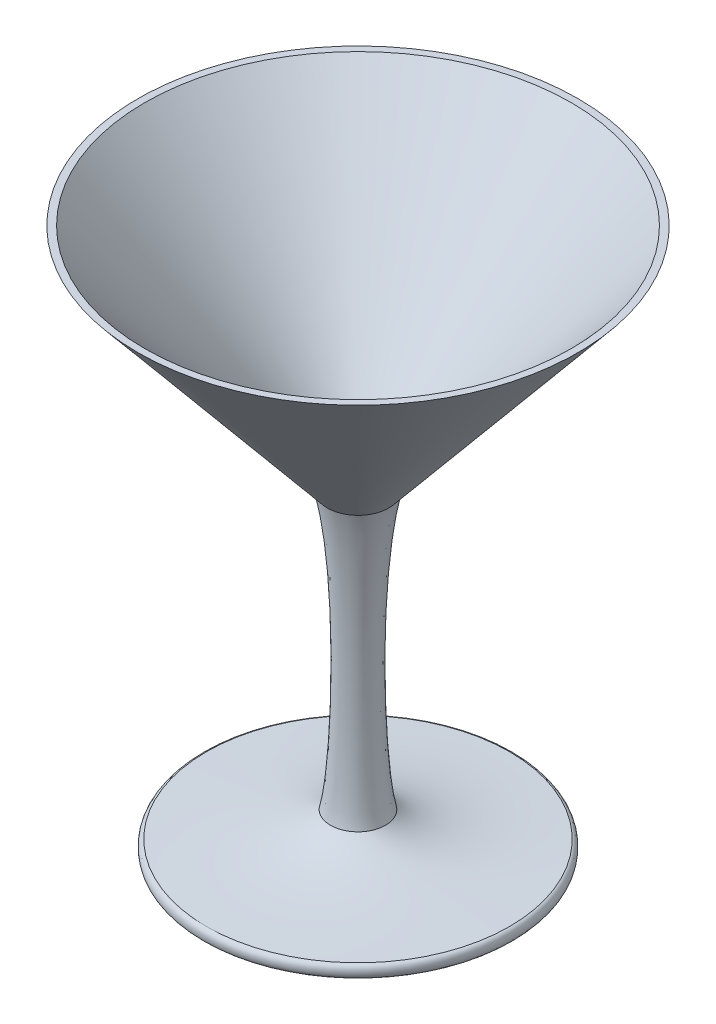
ISO-10303-21;
HEADER;
FILE_DESCRIPTION(('STEP AP214'),'2;1');
FILE_NAME('part.step','',(''),(''),'','','');
FILE_SCHEMA(('AUTOMOTIVE_DESIGN { 1 0 10303 214 1 1 1 1 }'));
ENDSEC;
DATA;
#1=APPLICATION_CONTEXT('core data for automotive mechanical design processes');
#2=APPLICATION_PROTOCOL_DEFINITION('international standard','automotive_design',2000,#1);
#3=PRODUCT_CONTEXT('',#1,'mechanical');
#4=PRODUCT('Part','Part','',(#3));
#5=PRODUCT_RELATED_PRODUCT_CATEGORY('part','',(#4));
#6=PRODUCT_DEFINITION_FORMATION('','',#4);
#7=PRODUCT_DEFINITION_CONTEXT('part definition',#1,'design');
#8=PRODUCT_DEFINITION('design','',#6,#7);
#9=PRODUCT_DEFINITION_SHAPE('','',#8);
#10=(LENGTH_UNIT() NAMED_UNIT(*) SI_UNIT(.MILLI.,.METRE.));
#11=(NAMED_UNIT(*) PLANE_ANGLE_UNIT() SI_UNIT($,.RADIAN.));
#12=(NAMED_UNIT(*) SI_UNIT($,.STERADIAN.) SOLID_ANGLE_UNIT());
#13=UNCERTAINTY_MEASURE_WITH_UNIT(LENGTH_MEASURE(1.E-05),#10,'distance_accuracy_value','');
#14=(GEOMETRIC_REPRESENTATION_CONTEXT(3) GLOBAL_UNCERTAINTY_ASSIGNED_CONTEXT((#13)) GLOBAL_UNIT_ASSIGNED_CONTEXT((#10,
#11,#12)) REPRESENTATION_CONTEXT('',''));
#15=CARTESIAN_POINT('',(0.,0.,0.));
#16=DIRECTION('',(0.,0.,1.));
#17=DIRECTION('',(1.,0.,0.));
#18=AXIS2_PLACEMENT_3D('',#15,#16,#17);
#19=CARTESIAN_POINT('',(-159.420742678776,-336.87748813054,0.));
#20=DIRECTION('',(0.,-1.,0.));
#21=DIRECTION('',(0.,0.,-1.));
#22=AXIS2_PLACEMENT_3D('',#19,#20,#21);
#23=PLANE('',#22);
#24=CARTESIAN_POINT('',(-159.420742678776,-336.87748813054,0.));
#25=DIRECTION('',(0.,1.,0.));
#26=DIRECTION('',(0.,0.,1.));
#27=AXIS2_PLACEMENT_3D('',#24,#25,#26);
#28=CIRCLE('',#27,31.6674314944976);
#29=CARTESIAN_POINT('',(-159.420742678776,-336.87748813054,31.6674314944976));
#30=VERTEX_POINT('',#29);
#31=EDGE_CURVE('E10',#30,#30,#28,.T.);
#32=ORIENTED_EDGE('',*,*,#31,.F.);
#33=EDGE_LOOP('',(#32));
#34=FACE_BOUND('',#33,.T.);
#35=ADVANCED_FACE('F37',(#34),#23,.T.);
#36=CARTESIAN_POINT('',(-190.96464518816,-334.304345553392,0.));
#37=CARTESIAN_POINT('',(-192.19304753262,-334.61112318083,0.));
#38=CARTESIAN_POINT('',(-191.925483576352,-336.88284847709,0.));
#39=CARTESIAN_POINT('',(-191.088174173274,-336.87748813054,0.));
#40=B_SPLINE_CURVE_WITH_KNOTS('',3,(#36,#37,#38,#39),.UNSPECIFIED.,.F.,.F.,(4,4),(0.,
0.195979379794336),.UNSPECIFIED.);
#41=CARTESIAN_POINT('',(-159.420742678776,-270.244800903918,0.));
#42=DIRECTION('',(0.,1.,0.));
#43=AXIS1_PLACEMENT('',#41,#42);
#44=SURFACE_OF_REVOLUTION('',#40,#43);
#45=ORIENTED_EDGE('',*,*,#31,.T.);
#46=EDGE_LOOP('',(#45));
#47=FACE_BOUND('',#46,.T.);
#48=CARTESIAN_POINT('',(-159.420742678776,-334.304345553392,0.));
#49=DIRECTION('',(0.,1.,0.));
#50=DIRECTION('',(0.,0.,1.));
#51=AXIS2_PLACEMENT_3D('',#48,#49,#50);
#52=CIRCLE('',#51,31.5439025093838);
#53=CARTESIAN_POINT('',(-159.420742678776,-334.304345553392,31.5439025093838));
#54=VERTEX_POINT('',#53);
#55=EDGE_CURVE('E44',#54,#54,#52,.T.);
#56=ORIENTED_EDGE('',*,*,#55,.F.);
#57=EDGE_LOOP('',(#56));
#58=FACE_BOUND('',#57,.T.);
#59=ADVANCED_FACE('F79',(#47,#58),#44,.F.);
#60=CARTESIAN_POINT('',(-165.144069858798,-328.95329504754,0.));
#61=CARTESIAN_POINT('',(-169.837453965653,-333.171753818438,0.));
#62=CARTESIAN_POINT('',(-179.536145115249,-333.82852052167,0.));
#63=CARTESIAN_POINT('',(-190.96464518816,-334.304345553392,0.));
#64=B_SPLINE_CURVE_WITH_KNOTS('',3,(#60,#61,#62,#63),.UNSPECIFIED.,.F.,.F.,(4,4),(0.,
0.834301137813903),.UNSPECIFIED.);
#65=CARTESIAN_POINT('',(-159.420742678776,-270.244800903918,0.));
#66=DIRECTION('',(0.,1.,0.));
#67=AXIS1_PLACEMENT('',#65,#66);
#68=SURFACE_OF_REVOLUTION('',#64,#67);
#69=ORIENTED_EDGE('',*,*,#55,.T.);
#70=EDGE_LOOP('',(#69));
#71=FACE_BOUND('',#70,.T.);
#72=CARTESIAN_POINT('',(-159.420742678776,-328.95329504754,0.));
#73=DIRECTION('',(0.,1.,0.));
#74=DIRECTION('',(0.,0.,1.));
#75=AXIS2_PLACEMENT_3D('',#72,#73,#74);
#76=CIRCLE('',#75,5.72332718002147);
#77=CARTESIAN_POINT('',(-159.420742678776,-328.95329504754,5.72332718002147));
#78=VERTEX_POINT('',#77);
#79=EDGE_CURVE('E49',#78,#78,#76,.T.);
#80=ORIENTED_EDGE('',*,*,#79,.F.);
#81=EDGE_LOOP('',(#80));
#82=FACE_BOUND('',#81,.T.);
#83=ADVANCED_FACE('F82',(#71,#82),#68,.F.);
#84=CARTESIAN_POINT('',(-165.81034098499,-271.404559168786,0.));
#85=CARTESIAN_POINT('',(-162.204633443118,-287.930293232054,0.));
#86=CARTESIAN_POINT('',(-163.227748310136,-321.791320533154,0.));
#87=CARTESIAN_POINT('',(-165.144069858798,-328.953295047541,0.));
#88=B_SPLINE_CURVE_WITH_KNOTS('',3,(#84,#85,#86,#87),.UNSPECIFIED.,.F.,.F.,(4,4),(0.,1.),.UNSPECIFIED.);
#89=CARTESIAN_POINT('',(-159.420742678776,-270.244800903918,0.));
#90=DIRECTION('',(0.,1.,0.));
#91=AXIS1_PLACEMENT('',#89,#90);
#92=SURFACE_OF_REVOLUTION('',#88,#91);
#93=ORIENTED_EDGE('',*,*,#79,.T.);
#94=EDGE_LOOP('',(#93));
#95=FACE_BOUND('',#94,.T.);
#96=CARTESIAN_POINT('',(-159.420742678776,-271.404559168786,0.));
#97=DIRECTION('',(0.,1.,0.));
#98=DIRECTION('',(0.,0.,1.));
#99=AXIS2_PLACEMENT_3D('',#96,#97,#98);
#100=CIRCLE('',#99,6.38959830621391);
#101=CARTESIAN_POINT('',(-159.420742678776,-271.404559168786,6.38959830621388));
#102=VERTEX_POINT('',#101);
#103=EDGE_CURVE('E54',#102,#102,#100,.T.);
#104=ORIENTED_EDGE('',*,*,#103,.F.);
#105=EDGE_LOOP('',(#104));
#106=FACE_BOUND('',#105,.T.);
#107=ADVANCED_FACE('F85',(#95,#106),#92,.F.);
#108=CARTESIAN_POINT('',(-159.420742678776,-223.671915038773,0.));
#109=DIRECTION('',(0.,1.,0.));
#110=DIRECTION('',(0.,0.,1.));
#111=AXIS2_PLACEMENT_3D('',#108,#109,#110);
#112=CONICAL_SURFACE('',#111,45.8173729073988,0.690402372815751);
#113=CARTESIAN_POINT('',(-159.420742678776,-223.671915038773,0.));
#114=DIRECTION('',(0.,1.,0.));
#115=DIRECTION('',(0.,0.,1.));
#116=AXIS2_PLACEMENT_3D('',#113,#114,#115);
#117=CIRCLE('',#116,45.8173729073988);
#118=CARTESIAN_POINT('',(-159.420742678776,-223.671915038773,45.8173729073987));
#119=VERTEX_POINT('',#118);
#120=EDGE_CURVE('E59',#119,#119,#117,.T.);
#121=CARTESIAN_POINT('',(-159.420742678776,-271.404559168786,6.38959830621388));
#122=CARTESIAN_POINT('',(-159.420742678776,-270.907344125765,6.80030429164291));
#123=CARTESIAN_POINT('',(-159.420742678776,-270.410129082745,7.21101027707192));
#124=CARTESIAN_POINT('',(-159.420742678776,-269.415698996703,8.03242224792993));
#125=CARTESIAN_POINT('',(-159.420742678776,-268.918483953682,8.44312823335893));
#126=CARTESIAN_POINT('',(-159.420742678776,-267.92405386764,9.26454020421694));
#127=CARTESIAN_POINT('',(-159.420742678776,-267.426838824619,9.67524618964595));
#128=CARTESIAN_POINT('',(-159.420742678776,-266.432408738577,10.496658160504));
#129=CARTESIAN_POINT('',(-159.420742678776,-265.935193695556,10.907364145933));
#130=CARTESIAN_POINT('',(-159.420742678776,-264.940763609514,11.728776116791));
#131=CARTESIAN_POINT('',(-159.420742678776,-264.443548566493,12.13948210222));
#132=CARTESIAN_POINT('',(-159.420742678776,-263.449118480451,12.960894073078));
#133=CARTESIAN_POINT('',(-159.420742678776,-262.95190343743,13.371600058507));
#134=CARTESIAN_POINT('',(-159.420742678776,-261.957473351388,14.1930120293651));
#135=CARTESIAN_POINT('',(-159.420742678776,-261.460258308367,14.6037180147941));
#136=CARTESIAN_POINT('',(-159.420742678776,-260.465828222325,15.4251299856521));
#137=CARTESIAN_POINT('',(-159.420742678776,-259.968613179304,15.8358359710811));
#138=CARTESIAN_POINT('',(-159.420742678776,-258.974183093262,16.6572479419391));
#139=CARTESIAN_POINT('',(-159.420742678776,-258.476968050241,17.0679539273681));
#140=CARTESIAN_POINT('',(-159.420742678776,-257.482537964199,17.8893658982261));
#141=CARTESIAN_POINT('',(-159.420742678776,-256.985322921178,18.3000718836551));
#142=CARTESIAN_POINT('',(-159.420742678776,-255.990892835136,19.1214838545132));
#143=CARTESIAN_POINT('',(-159.420742678776,-255.493677792115,19.5321898399422));
#144=CARTESIAN_POINT('',(-159.420742678776,-254.499247706073,20.3536018108002));
#145=CARTESIAN_POINT('',(-159.420742678776,-254.002032663052,20.7643077962292));
#146=CARTESIAN_POINT('',(-159.420742678776,-253.007602577011,21.5857197670872));
#147=CARTESIAN_POINT('',(-159.420742678776,-252.51038753399,21.9964257525162));
#148=CARTESIAN_POINT('',(-159.420742678776,-251.515957447948,22.8178377233743));
#149=CARTESIAN_POINT('',(-159.420742678776,-251.018742404927,23.2285437088033));
#150=CARTESIAN_POINT('',(-159.420742678776,-250.024312318885,24.0499556796613));
#151=CARTESIAN_POINT('',(-159.420742678776,-249.527097275864,24.4606616650903));
#152=CARTESIAN_POINT('',(-159.420742678776,-248.532667189822,25.2820736359483));
#153=CARTESIAN_POINT('',(-159.420742678776,-248.035452146801,25.6927796213773));
#154=CARTESIAN_POINT('',(-159.420742678776,-247.041022060759,26.5141915922353));
#155=CARTESIAN_POINT('',(-159.420742678776,-246.543807017738,26.9248975776643));
#156=CARTESIAN_POINT('',(-159.420742678776,-245.549376931696,27.7463095485224));
#157=CARTESIAN_POINT('',(-159.420742678776,-245.052161888675,28.1570155339514));
#158=CARTESIAN_POINT('',(-159.420742678776,-244.057731802633,28.9784275048094));
#159=CARTESIAN_POINT('',(-159.420742678776,-243.560516759612,29.3891334902384));
#160=CARTESIAN_POINT('',(-159.420742678776,-242.56608667357,30.2105454610964));
#161=CARTESIAN_POINT('',(-159.420742678776,-242.068871630549,30.6212514465254));
#162=CARTESIAN_POINT('',(-159.420742678776,-241.074441544507,31.4426634173834));
#163=CARTESIAN_POINT('',(-159.420742678776,-240.577226501486,31.8533694028124));
#164=CARTESIAN_POINT('',(-159.420742678776,-239.582796415444,32.6747813736705));
#165=CARTESIAN_POINT('',(-159.420742678776,-239.085581372423,33.0854873590995));
#166=CARTESIAN_POINT('',(-159.420742678776,-238.091151286382,33.9068993299575));
#167=CARTESIAN_POINT('',(-159.420742678776,-237.593936243361,34.3176053153865));
#168=CARTESIAN_POINT('',(-159.420742678776,-236.599506157319,35.1390172862445));
#169=CARTESIAN_POINT('',(-159.420742678776,-236.102291114298,35.5497232716735));
#170=CARTESIAN_POINT('',(-159.420742678776,-235.107861028256,36.3711352425316));
#171=CARTESIAN_POINT('',(-159.420742678776,-234.610645985235,36.7818412279605));
#172=CARTESIAN_POINT('',(-159.420742678776,-233.616215899193,37.6032531988186));
#173=CARTESIAN_POINT('',(-159.420742678776,-233.119000856172,38.0139591842476));
#174=CARTESIAN_POINT('',(-159.420742678776,-232.12457077013,38.8353711551056));
#175=CARTESIAN_POINT('',(-159.420742678776,-231.627355727109,39.2460771405346));
#176=CARTESIAN_POINT('',(-159.420742678776,-230.632925641067,40.0674891113926));
#177=CARTESIAN_POINT('',(-159.420742678776,-230.135710598046,40.4781950968216));
#178=CARTESIAN_POINT('',(-159.420742678776,-229.141280512004,41.2996070676797));
#179=CARTESIAN_POINT('',(-159.420742678776,-228.644065468983,41.7103130531087));
#180=CARTESIAN_POINT('',(-159.420742678776,-227.649635382941,42.5317250239667));
#181=CARTESIAN_POINT('',(-159.420742678776,-227.15242033992,42.9424310093957));
#182=CARTESIAN_POINT('',(-159.420742678776,-226.157990253878,43.7638429802537));
#183=CARTESIAN_POINT('',(-159.420742678776,-225.660775210857,44.1745489656827));
#184=CARTESIAN_POINT('',(-159.420742678776,-224.666345124815,44.9959609365407));
#185=CARTESIAN_POINT('',(-159.420742678776,-224.169130081794,45.4066669219697));
#186=CARTESIAN_POINT('',(-159.420742678776,-223.671915038773,45.8173729073987));
#187=B_SPLINE_CURVE_WITH_KNOTS('',3,(#121,#122,#123,#124,#125,#126,#127,#128,#129,#130,#131,
#132,#133,#134,#135,#136,#137,#138,#139,#140,#141,#142,#143,#144,#145,#146,#147,#148,#149,#150,
#151,#152,#153,#154,#155,#156,#157,#158,#159,#160,#161,#162,#163,#164,#165,#166,#167,#168,#169,
#170,#171,#172,#173,#174,#175,#176,#177,#178,#179,#180,#181,#182,#183,#184,#185,#186),
.UNSPECIFIED.,.F.,.F.,(4,2,2,2,2,2,2,2,2,2,2,2,2,2,2,2,2,2,2,2,2,2,2,2,2,2,2,2,2,2,2,2,4),(0.,
1.9347144102585,3.86942882051703,5.80414323077556,7.7388576410341,9.67357205129264,
11.6082864615511,13.5430008718097,15.4777152820682,17.4124296923267,19.3471441025853,
21.2818585128438,23.2165729231023,25.1512873333608,27.0860017436194,29.0207161538779,
30.9554305641364,32.890144974395,34.8248593846535,36.759573794912,38.6942882051706,
40.6290026154291,42.5637170256876,44.4984314359462,46.4331458462047,48.3678602564632,
50.3025746667217,52.2372890769802,54.1720034872388,56.1067178974973,58.0414323077558,
59.9761467180144,61.9108611282729),.UNSPECIFIED.);
#188=EDGE_CURVE('BSEAM88',#102,#119,#187,.T.);
#189=ORIENTED_EDGE('',*,*,#103,.T.);
#190=ORIENTED_EDGE('',*,*,#120,.F.);
#191=ORIENTED_EDGE('',*,*,#188,.T.);
#192=ORIENTED_EDGE('',*,*,#188,.F.);
#193=EDGE_LOOP('',(#189,#191,#190,#192));
#194=FACE_BOUND('',#193,.T.);
#195=ADVANCED_FACE('F88',(#194),#112,.T.);
#196=CARTESIAN_POINT('',(-205.238115586175,-223.671915038773,0.));
#197=DIRECTION('',(0.,1.,0.));
#198=DIRECTION('',(0.,0.,1.));
#199=AXIS2_PLACEMENT_3D('',#196,#197,#198);
#200=PLANE('',#199);
#201=ORIENTED_EDGE('',*,*,#120,.T.);
#202=EDGE_LOOP('',(#201));
#203=FACE_BOUND('',#202,.T.);
#204=CARTESIAN_POINT('',(-159.420742678776,-223.671915038773,0.));
#205=DIRECTION('',(0.,1.,0.));
#206=DIRECTION('',(0.,0.,1.));
#207=AXIS2_PLACEMENT_3D('',#204,#205,#206);
#208=CIRCLE('',#207,44.3861114600712);
#209=CARTESIAN_POINT('',(-159.420742678776,-223.671915038773,44.3861114600712));
#210=VERTEX_POINT('',#209);
#211=EDGE_CURVE('E62',#210,#210,#208,.T.);
#212=ORIENTED_EDGE('',*,*,#211,.F.);
#213=EDGE_LOOP('',(#212));
#214=FACE_BOUND('',#213,.T.);
#215=ADVANCED_FACE('F98',(#203,#214),#200,.T.);
#216=CARTESIAN_POINT('',(-159.420742678776,-268.41123500094,0.));
#217=DIRECTION('',(0.,1.,0.));
#218=DIRECTION('',(0.,0.,1.));
#219=AXIS2_PLACEMENT_3D('',#216,#217,#218);
#220=CONICAL_SURFACE('',#219,4.77136642087952,0.724721958908642);
#221=CARTESIAN_POINT('',(-159.420742678776,-268.41123500094,0.));
#222=DIRECTION('',(0.,1.,0.));
#223=DIRECTION('',(0.,0.,1.));
#224=AXIS2_PLACEMENT_3D('',#221,#222,#223);
#225=CIRCLE('',#224,4.77136642087952);
#226=CARTESIAN_POINT('',(-159.420742678776,-268.41123500094,4.7713664208795));
#227=VERTEX_POINT('',#226);
#228=EDGE_CURVE('E65',#227,#227,#225,.T.);
#229=CARTESIAN_POINT('',(-159.420742678776,-223.671915038773,44.3861114600712));
#230=CARTESIAN_POINT('',(-159.420742678776,-224.137949621713,43.973457865913));
#231=CARTESIAN_POINT('',(-159.420742678776,-224.603984204652,43.5608042717547));
#232=CARTESIAN_POINT('',(-159.420742678776,-225.53605337053,42.7354970834382));
#233=CARTESIAN_POINT('',(-159.420742678776,-226.00208795347,42.32284348928));
#234=CARTESIAN_POINT('',(-159.420742678776,-226.934157119348,41.4975363009635));
#235=CARTESIAN_POINT('',(-159.420742678776,-227.400191702287,41.0848827068052));
#236=CARTESIAN_POINT('',(-159.420742678776,-228.332260868166,40.2595755184888));
#237=CARTESIAN_POINT('',(-159.420742678776,-228.798295451105,39.8469219243305));
#238=CARTESIAN_POINT('',(-159.420742678776,-229.730364616984,39.021614736014));
#239=CARTESIAN_POINT('',(-159.420742678776,-230.196399199923,38.6089611418558));
#240=CARTESIAN_POINT('',(-159.420742678776,-231.128468365801,37.7836539535393));
#241=CARTESIAN_POINT('',(-159.420742678776,-231.59450294874,37.371000359381));
#242=CARTESIAN_POINT('',(-159.420742678776,-232.526572114619,36.5456931710645));
#243=CARTESIAN_POINT('',(-159.420742678776,-232.992606697558,36.1330395769063));
#244=CARTESIAN_POINT('',(-159.420742678776,-233.924675863437,35.3077323885898));
#245=CARTESIAN_POINT('',(-159.420742678776,-234.390710446376,34.8950787944315));
#246=CARTESIAN_POINT('',(-159.420742678776,-235.322779612254,34.0697716061151));
#247=CARTESIAN_POINT('',(-159.420742678776,-235.788814195194,33.6571180119568));
#248=CARTESIAN_POINT('',(-159.420742678776,-236.720883361072,32.8318108236403));
#249=CARTESIAN_POINT('',(-159.420742678776,-237.186917944011,32.4191572294821));
#250=CARTESIAN_POINT('',(-159.420742678776,-238.11898710989,31.5938500411656));
#251=CARTESIAN_POINT('',(-159.420742678776,-238.585021692829,31.1811964470073));
#252=CARTESIAN_POINT('',(-159.420742678776,-239.517090858707,30.3558892586908));
#253=CARTESIAN_POINT('',(-159.420742678776,-239.983125441647,29.9432356645326));
#254=CARTESIAN_POINT('',(-159.420742678776,-240.915194607525,29.1179284762161));
#255=CARTESIAN_POINT('',(-159.420742678776,-241.381229190464,28.7052748820578));
#256=CARTESIAN_POINT('',(-159.420742678776,-242.313298356343,27.8799676937413));
#257=CARTESIAN_POINT('',(-159.420742678776,-242.779332939282,27.4673140995831));
#258=CARTESIAN_POINT('',(-159.420742678776,-243.711402105161,26.6420069112666));
#259=CARTESIAN_POINT('',(-159.420742678776,-244.1774366881,26.2293533171084));
#260=CARTESIAN_POINT('',(-159.420742678776,-245.109505853978,25.4040461287919));
#261=CARTESIAN_POINT('',(-159.420742678776,-245.575540436918,24.9913925346336));
#262=CARTESIAN_POINT('',(-159.420742678776,-246.507609602796,24.1660853463171));
#263=CARTESIAN_POINT('',(-159.420742678776,-246.973644185735,23.7534317521589));
#264=CARTESIAN_POINT('',(-159.420742678776,-247.905713351614,22.9281245638424));
#265=CARTESIAN_POINT('',(-159.420742678776,-248.371747934553,22.5154709696841));
#266=CARTESIAN_POINT('',(-159.420742678776,-249.303817100431,21.6901637813676));
#267=CARTESIAN_POINT('',(-159.420742678776,-249.769851683371,21.2775101872094));
#268=CARTESIAN_POINT('',(-159.420742678776,-250.701920849249,20.4522029988929));
#269=CARTESIAN_POINT('',(-159.420742678776,-251.167955432188,20.0395494047346));
#270=CARTESIAN_POINT('',(-159.420742678776,-252.100024598067,19.2142422164181));
#271=CARTESIAN_POINT('',(-159.420742678776,-252.566059181006,18.8015886222599));
#272=CARTESIAN_POINT('',(-159.420742678776,-253.498128346884,17.9762814339434));
#273=CARTESIAN_POINT('',(-159.420742678776,-253.964162929824,17.5636278397852));
#274=CARTESIAN_POINT('',(-159.420742678776,-254.896232095702,16.7383206514687));
#275=CARTESIAN_POINT('',(-159.420742678776,-255.362266678641,16.3256670573104));
#276=CARTESIAN_POINT('',(-159.420742678776,-256.29433584452,15.5003598689939));
#277=CARTESIAN_POINT('',(-159.420742678776,-256.760370427459,15.0877062748357));
#278=CARTESIAN_POINT('',(-159.420742678776,-257.692439593338,14.2623990865192));
#279=CARTESIAN_POINT('',(-159.420742678776,-258.158474176277,13.8497454923609));
#280=CARTESIAN_POINT('',(-159.420742678776,-259.090543342155,13.0244383040444));
#281=CARTESIAN_POINT('',(-159.420742678776,-259.556577925095,12.6117847098862));
#282=CARTESIAN_POINT('',(-159.420742678776,-260.488647090973,11.7864775215697));
#283=CARTESIAN_POINT('',(-159.420742678776,-260.954681673912,11.3738239274114));
#284=CARTESIAN_POINT('',(-159.420742678776,-261.886750839791,10.548516739095));
#285=CARTESIAN_POINT('',(-159.420742678776,-262.35278542273,10.1358631449367));
#286=CARTESIAN_POINT('',(-159.420742678776,-263.284854588608,9.31055595662022));
#287=CARTESIAN_POINT('',(-159.420742678776,-263.750889171548,8.89790236246197));
#288=CARTESIAN_POINT('',(-159.420742678776,-264.682958337426,8.07259517414547));
#289=CARTESIAN_POINT('',(-159.420742678776,-265.148992920365,7.65994157998723));
#290=CARTESIAN_POINT('',(-159.420742678776,-266.081062086244,6.83463439167074));
#291=CARTESIAN_POINT('',(-159.420742678776,-266.547096669183,6.42198079751249));
#292=CARTESIAN_POINT('',(-159.420742678776,-267.479165835062,5.596673609196));
#293=CARTESIAN_POINT('',(-159.420742678776,-267.945200418001,5.18402001503776));
#294=CARTESIAN_POINT('',(-159.420742678776,-268.41123500094,4.7713664208795));
#295=B_SPLINE_CURVE_WITH_KNOTS('',3,(#229,#230,#231,#232,#233,#234,#235,#236,#237,#238,#239,
#240,#241,#242,#243,#244,#245,#246,#247,#248,#249,#250,#251,#252,#253,#254,#255,#256,#257,#258,
#259,#260,#261,#262,#263,#264,#265,#266,#267,#268,#269,#270,#271,#272,#273,#274,#275,#276,#277,
#278,#279,#280,#281,#282,#283,#284,#285,#286,#287,#288,#289,#290,#291,#292,#293,#294),
.UNSPECIFIED.,.F.,.F.,(4,2,2,2,2,2,2,2,2,2,2,2,2,2,2,2,2,2,2,2,2,2,2,2,2,2,2,2,2,2,2,2,4),(0.,
1.86741559150703,3.73483118301408,5.6022467745211,7.46966236602815,9.3370779575352,
11.2044935490422,13.0719091405493,14.9393247320563,16.8067403235633,18.6741559150704,
20.5415715065774,22.4089870980845,24.2764026895915,26.1438182810986,28.0112338726056,
29.8786494641126,31.7460650556197,33.6134806471267,35.4808962386338,37.3483118301408,
39.2157274216478,41.0831430131549,42.9505586046619,44.817974196169,46.685389787676,
48.5528053791831,50.4202209706901,52.2876365621972,54.1550521537042,56.0224677452112,
57.8898833367183,59.7572989282253),.UNSPECIFIED.);
#296=EDGE_CURVE('BSEAM102',#210,#227,#295,.T.);
#297=ORIENTED_EDGE('',*,*,#211,.T.);
#298=ORIENTED_EDGE('',*,*,#228,.F.);
#299=ORIENTED_EDGE('',*,*,#296,.T.);
#300=ORIENTED_EDGE('',*,*,#296,.F.);
#301=EDGE_LOOP('',(#297,#299,#298,#300));
#302=FACE_BOUND('',#301,.T.);
#303=ADVANCED_FACE('F102',(#302),#220,.F.);
#304=CARTESIAN_POINT('',(-159.420742678776,-263.119913437253,0.));
#305=DIRECTION('',(0.,1.,0.));
#306=DIRECTION('',(-1.,0.,0.));
#307=AXIS2_PLACEMENT_3D('',#304,#305,#306);
#308=SPHERICAL_SURFACE('',#307,7.1248874666646);
#309=ORIENTED_EDGE('',*,*,#228,.T.);
#310=EDGE_LOOP('',(#309));
#311=FACE_BOUND('',#310,.T.);
#312=ADVANCED_FACE('F106',(#311),#308,.F.);
#313=CLOSED_SHELL('',(#35,#59,#83,#107,#195,#215,#303,#312));
#314=MANIFOLD_SOLID_BREP('B2',#313);
#315=ADVANCED_BREP_SHAPE_REPRESENTATION('',(#18,#314),#14);
#316=SHAPE_DEFINITION_REPRESENTATION(#9,#315);
ENDSEC;
END-ISO-10303-21;
